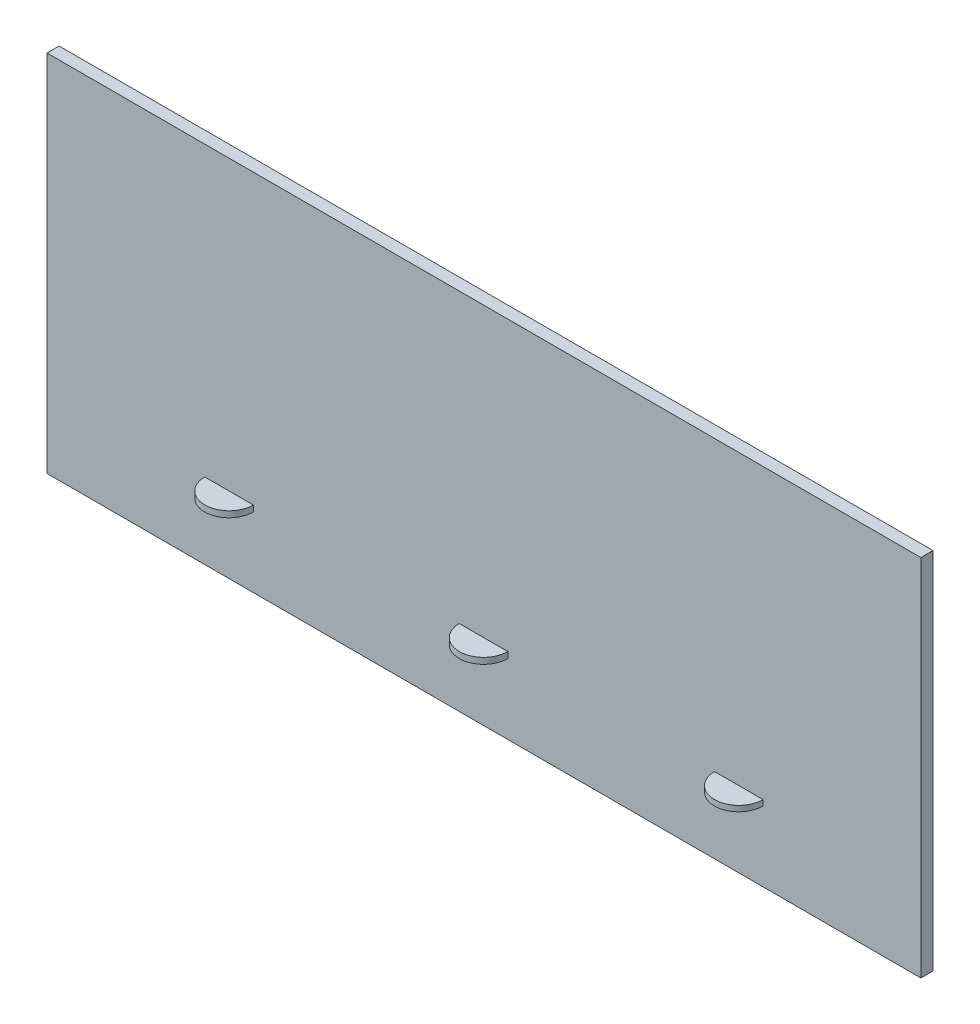
ISO-10303-21;
HEADER;
FILE_DESCRIPTION(('STEP AP214'),'2;1');
FILE_NAME('part.step','',(''),(''),'','','');
FILE_SCHEMA(('AUTOMOTIVE_DESIGN { 1 0 10303 214 1 1 1 1 }'));
ENDSEC;
DATA;
#1=APPLICATION_CONTEXT('core data for automotive mechanical design processes');
#2=APPLICATION_PROTOCOL_DEFINITION('international standard','automotive_design',2000,#1);
#3=PRODUCT_CONTEXT('',#1,'mechanical');
#4=PRODUCT('Part','Part','',(#3));
#5=PRODUCT_RELATED_PRODUCT_CATEGORY('part','',(#4));
#6=PRODUCT_DEFINITION_FORMATION('','',#4);
#7=PRODUCT_DEFINITION_CONTEXT('part definition',#1,'design');
#8=PRODUCT_DEFINITION('design','',#6,#7);
#9=PRODUCT_DEFINITION_SHAPE('','',#8);
#10=(LENGTH_UNIT() NAMED_UNIT(*) SI_UNIT(.MILLI.,.METRE.));
#11=(NAMED_UNIT(*) PLANE_ANGLE_UNIT() SI_UNIT($,.RADIAN.));
#12=(NAMED_UNIT(*) SI_UNIT($,.STERADIAN.) SOLID_ANGLE_UNIT());
#13=UNCERTAINTY_MEASURE_WITH_UNIT(LENGTH_MEASURE(1.E-05),#10,'distance_accuracy_value','');
#14=(GEOMETRIC_REPRESENTATION_CONTEXT(3) GLOBAL_UNCERTAINTY_ASSIGNED_CONTEXT((#13)) GLOBAL_UNIT_ASSIGNED_CONTEXT((#10,
#11,#12)) REPRESENTATION_CONTEXT('',''));
#15=CARTESIAN_POINT('',(0.,0.,0.));
#16=DIRECTION('',(0.,0.,1.));
#17=DIRECTION('',(1.,0.,0.));
#18=AXIS2_PLACEMENT_3D('',#15,#16,#17);
#19=CARTESIAN_POINT('',(0.,0.,25.4));
#20=DIRECTION('',(0.,0.,1.));
#21=DIRECTION('',(1.,0.,0.));
#22=AXIS2_PLACEMENT_3D('',#19,#20,#21);
#23=PLANE('',#22);
#24=DIRECTION('',(0.,1.,0.));
#25=VECTOR('',#24,1.);
#26=CARTESIAN_POINT('',(392.796405658915,103.491890903693,25.4));
#27=LINE('',#26,#25);
#28=CARTESIAN_POINT('',(392.796405658915,103.491890903693,25.4));
#29=VERTEX_POINT('',#28);
#30=CARTESIAN_POINT('',(392.796405658915,116.191890903693,25.4));
#31=VERTEX_POINT('',#30);
#32=EDGE_CURVE('E109',#29,#31,#27,.T.);
#33=ORIENTED_EDGE('',*,*,#32,.F.);
#34=DIRECTION('',(1.,0.,0.));
#35=VECTOR('',#34,1.);
#36=CARTESIAN_POINT('',(291.196405658915,103.491890903693,25.4));
#37=LINE('',#36,#35);
#38=CARTESIAN_POINT('',(291.196405658915,103.491890903693,25.4));
#39=VERTEX_POINT('',#38);
#40=EDGE_CURVE('E121',#39,#29,#37,.T.);
#41=ORIENTED_EDGE('',*,*,#40,.F.);
#42=DIRECTION('',(0.,-1.,0.));
#43=VECTOR('',#42,1.);
#44=CARTESIAN_POINT('',(291.196405658915,116.191890903693,25.4));
#45=LINE('',#44,#43);
#46=CARTESIAN_POINT('',(291.196405658915,116.191890903693,25.4));
#47=VERTEX_POINT('',#46);
#48=EDGE_CURVE('E128',#47,#39,#45,.T.);
#49=ORIENTED_EDGE('',*,*,#48,.F.);
#50=DIRECTION('',(-1.,0.,0.));
#51=VECTOR('',#50,1.);
#52=CARTESIAN_POINT('',(341.996405658915,116.191890903693,25.4));
#53=LINE('',#52,#51);
#54=EDGE_CURVE('E120',#31,#47,#53,.T.);
#55=ORIENTED_EDGE('',*,*,#54,.F.);
#56=EDGE_LOOP('',(#33,#41,#49,#55));
#57=FACE_BOUND('',#56,.T.);
#58=DIRECTION('',(0.,1.,0.));
#59=VECTOR('',#58,1.);
#60=CARTESIAN_POINT('',(925.404865323267,104.163799968321,25.4));
#61=LINE('',#60,#59);
#62=CARTESIAN_POINT('',(925.404865323267,104.163799968321,25.4));
#63=VERTEX_POINT('',#62);
#64=CARTESIAN_POINT('',(925.404865323267,116.863799968321,25.4));
#65=VERTEX_POINT('',#64);
#66=EDGE_CURVE('E292',#63,#65,#61,.T.);
#67=ORIENTED_EDGE('',*,*,#66,.F.);
#68=DIRECTION('',(1.,0.,0.));
#69=VECTOR('',#68,1.);
#70=CARTESIAN_POINT('',(823.804865323267,104.163799968321,25.4));
#71=LINE('',#70,#69);
#72=CARTESIAN_POINT('',(823.804865323267,104.163799968321,25.4));
#73=VERTEX_POINT('',#72);
#74=EDGE_CURVE('E299',#73,#63,#71,.T.);
#75=ORIENTED_EDGE('',*,*,#74,.F.);
#76=DIRECTION('',(0.,-1.,0.));
#77=VECTOR('',#76,1.);
#78=CARTESIAN_POINT('',(823.804865323267,116.863799968321,25.4));
#79=LINE('',#78,#77);
#80=CARTESIAN_POINT('',(823.804865323267,116.863799968321,25.4));
#81=VERTEX_POINT('',#80);
#82=EDGE_CURVE('E304',#81,#73,#79,.T.);
#83=ORIENTED_EDGE('',*,*,#82,.F.);
#84=DIRECTION('',(-1.,0.,0.));
#85=VECTOR('',#84,1.);
#86=CARTESIAN_POINT('',(874.604865323267,116.863799968321,25.4));
#87=LINE('',#86,#85);
#88=EDGE_CURVE('E298',#65,#81,#87,.T.);
#89=ORIENTED_EDGE('',*,*,#88,.F.);
#90=EDGE_LOOP('',(#67,#75,#83,#89));
#91=FACE_BOUND('',#90,.T.);
#92=DIRECTION('',(0.,1.,0.));
#93=VECTOR('',#92,1.);
#94=CARTESIAN_POINT('',(1459.59640565891,104.010823647008,25.4));
#95=LINE('',#94,#93);
#96=CARTESIAN_POINT('',(1459.59640565891,104.010823647008,25.4));
#97=VERTEX_POINT('',#96);
#98=CARTESIAN_POINT('',(1459.59640565891,115.672958160379,25.4));
#99=VERTEX_POINT('',#98);
#100=EDGE_CURVE('E318',#97,#99,#95,.T.);
#101=ORIENTED_EDGE('',*,*,#100,.F.);
#102=DIRECTION('',(1.,0.,0.));
#103=VECTOR('',#102,1.);
#104=CARTESIAN_POINT('',(1357.99640565891,104.010823647008,25.4));
#105=LINE('',#104,#103);
#106=CARTESIAN_POINT('',(1357.99640565891,104.010823647008,25.4));
#107=VERTEX_POINT('',#106);
#108=EDGE_CURVE('E315',#107,#97,#105,.T.);
#109=ORIENTED_EDGE('',*,*,#108,.F.);
#110=DIRECTION('',(0.,-1.,0.));
#111=VECTOR('',#110,1.);
#112=CARTESIAN_POINT('',(1357.99640565891,115.672958160379,25.4));
#113=LINE('',#112,#111);
#114=CARTESIAN_POINT('',(1357.99640565891,115.672958160379,25.4));
#115=VERTEX_POINT('',#114);
#116=EDGE_CURVE('E322',#115,#107,#113,.T.);
#117=ORIENTED_EDGE('',*,*,#116,.F.);
#118=DIRECTION('',(-1.,0.,0.));
#119=VECTOR('',#118,1.);
#120=CARTESIAN_POINT('',(1408.79640565891,115.672958160379,25.4));
#121=LINE('',#120,#119);
#122=EDGE_CURVE('E320',#99,#115,#121,.T.);
#123=ORIENTED_EDGE('',*,*,#122,.F.);
#124=EDGE_LOOP('',(#101,#109,#117,#123));
#125=FACE_BOUND('',#124,.T.);
#126=DIRECTION('',(1.,0.,0.));
#127=VECTOR('',#126,1.);
#128=CARTESIAN_POINT('',(-39.0035943410847,-42.5581090963068,25.4));
#129=LINE('',#128,#127);
#130=CARTESIAN_POINT('',(-39.0035943410847,-42.5581090963068,25.4));
#131=VERTEX_POINT('',#130);
#132=CARTESIAN_POINT('',(1789.79640565891,-42.5581090963068,25.4));
#133=VERTEX_POINT('',#132);
#134=EDGE_CURVE('E137',#131,#133,#129,.T.);
#135=ORIENTED_EDGE('',*,*,#134,.T.);
#136=DIRECTION('',(0.,1.,0.));
#137=VECTOR('',#136,1.);
#138=CARTESIAN_POINT('',(1789.79640565892,719.441890903693,25.4));
#139=LINE('',#138,#137);
#140=CARTESIAN_POINT('',(1789.79640565892,719.441890903693,25.4));
#141=VERTEX_POINT('',#140);
#142=EDGE_CURVE('E140',#133,#141,#139,.T.);
#143=ORIENTED_EDGE('',*,*,#142,.T.);
#144=DIRECTION('',(-1.,0.,0.));
#145=VECTOR('',#144,1.);
#146=CARTESIAN_POINT('',(-39.0035943410848,719.441890903693,25.4));
#147=LINE('',#146,#145);
#148=CARTESIAN_POINT('',(-39.0035943410848,719.441890903693,25.4));
#149=VERTEX_POINT('',#148);
#150=EDGE_CURVE('E142',#141,#149,#147,.T.);
#151=ORIENTED_EDGE('',*,*,#150,.T.);
#152=DIRECTION('',(0.,-1.,0.));
#153=VECTOR('',#152,1.);
#154=CARTESIAN_POINT('',(-39.0035943410848,719.441890903693,25.4));
#155=LINE('',#154,#153);
#156=EDGE_CURVE('E134',#149,#131,#155,.T.);
#157=ORIENTED_EDGE('',*,*,#156,.T.);
#158=EDGE_LOOP('',(#135,#143,#151,#157));
#159=FACE_BOUND('',#158,.T.);
#160=ADVANCED_FACE('F33',(#57,#91,#125,#159),#23,.T.);
#161=CARTESIAN_POINT('',(-39.0035943410848,719.441890903693,25.4));
#162=DIRECTION('',(1.,0.,0.));
#163=DIRECTION('',(0.,1.,0.));
#164=AXIS2_PLACEMENT_3D('',#161,#162,#163);
#165=PLANE('',#164);
#166=DIRECTION('',(0.,-1.,0.));
#167=VECTOR('',#166,1.);
#168=CARTESIAN_POINT('',(-39.0035943410848,719.441890903693,0.));
#169=LINE('',#168,#167);
#170=CARTESIAN_POINT('',(-39.0035943410848,719.441890903693,0.));
#171=VERTEX_POINT('',#170);
#172=CARTESIAN_POINT('',(-39.0035943410847,-42.5581090963068,0.));
#173=VERTEX_POINT('',#172);
#174=EDGE_CURVE('E130',#171,#173,#169,.T.);
#175=ORIENTED_EDGE('',*,*,#174,.T.);
#176=DIRECTION('',(0.,0.,-1.));
#177=VECTOR('',#176,1.);
#178=CARTESIAN_POINT('',(-39.0035943410847,-42.5581090963068,25.4));
#179=LINE('',#178,#177);
#180=EDGE_CURVE('E11',#131,#173,#179,.T.);
#181=ORIENTED_EDGE('',*,*,#180,.F.);
#182=ORIENTED_EDGE('',*,*,#156,.F.);
#183=DIRECTION('',(0.,0.,-1.));
#184=VECTOR('',#183,1.);
#185=CARTESIAN_POINT('',(-39.0035943410848,719.441890903693,25.4));
#186=LINE('',#185,#184);
#187=EDGE_CURVE('E144',#149,#171,#186,.T.);
#188=ORIENTED_EDGE('',*,*,#187,.T.);
#189=EDGE_LOOP('',(#175,#181,#182,#188));
#190=FACE_BOUND('',#189,.T.);
#191=ADVANCED_FACE('F35',(#190),#165,.F.);
#192=CARTESIAN_POINT('',(-39.0035943410847,-42.5581090963068,25.4));
#193=DIRECTION('',(0.,1.,0.));
#194=DIRECTION('',(0.,0.,1.));
#195=AXIS2_PLACEMENT_3D('',#192,#193,#194);
#196=PLANE('',#195);
#197=DIRECTION('',(1.,0.,0.));
#198=VECTOR('',#197,1.);
#199=CARTESIAN_POINT('',(-39.0035943410847,-42.5581090963068,0.));
#200=LINE('',#199,#198);
#201=CARTESIAN_POINT('',(1789.79640565891,-42.5581090963068,0.));
#202=VERTEX_POINT('',#201);
#203=EDGE_CURVE('E147',#173,#202,#200,.T.);
#204=ORIENTED_EDGE('',*,*,#203,.T.);
#205=DIRECTION('',(0.,0.,-1.));
#206=VECTOR('',#205,1.);
#207=CARTESIAN_POINT('',(1789.79640565891,-42.5581090963068,25.4));
#208=LINE('',#207,#206);
#209=EDGE_CURVE('E41',#133,#202,#208,.T.);
#210=ORIENTED_EDGE('',*,*,#209,.F.);
#211=ORIENTED_EDGE('',*,*,#134,.F.);
#212=ORIENTED_EDGE('',*,*,#180,.T.);
#213=EDGE_LOOP('',(#204,#210,#211,#212));
#214=FACE_BOUND('',#213,.T.);
#215=ADVANCED_FACE('F176',(#214),#196,.F.);
#216=CARTESIAN_POINT('',(1789.79640565892,719.441890903693,25.4));
#217=DIRECTION('',(-1.,0.,0.));
#218=DIRECTION('',(0.,-1.,0.));
#219=AXIS2_PLACEMENT_3D('',#216,#217,#218);
#220=PLANE('',#219);
#221=DIRECTION('',(0.,1.,0.));
#222=VECTOR('',#221,1.);
#223=CARTESIAN_POINT('',(1789.79640565892,719.441890903693,0.));
#224=LINE('',#223,#222);
#225=CARTESIAN_POINT('',(1789.79640565892,719.441890903693,0.));
#226=VERTEX_POINT('',#225);
#227=EDGE_CURVE('E149',#202,#226,#224,.T.);
#228=ORIENTED_EDGE('',*,*,#227,.T.);
#229=DIRECTION('',(0.,0.,-1.));
#230=VECTOR('',#229,1.);
#231=CARTESIAN_POINT('',(1789.79640565892,719.441890903693,25.4));
#232=LINE('',#231,#230);
#233=EDGE_CURVE('E154',#141,#226,#232,.T.);
#234=ORIENTED_EDGE('',*,*,#233,.F.);
#235=ORIENTED_EDGE('',*,*,#142,.F.);
#236=ORIENTED_EDGE('',*,*,#209,.T.);
#237=EDGE_LOOP('',(#228,#234,#235,#236));
#238=FACE_BOUND('',#237,.T.);
#239=ADVANCED_FACE('F161',(#238),#220,.F.);
#240=CARTESIAN_POINT('',(-39.0035943410848,719.441890903693,25.4));
#241=DIRECTION('',(0.,-1.,0.));
#242=DIRECTION('',(0.,0.,-1.));
#243=AXIS2_PLACEMENT_3D('',#240,#241,#242);
#244=PLANE('',#243);
#245=DIRECTION('',(-1.,0.,0.));
#246=VECTOR('',#245,1.);
#247=CARTESIAN_POINT('',(-39.0035943410848,719.441890903693,0.));
#248=LINE('',#247,#246);
#249=EDGE_CURVE('E138',#226,#171,#248,.T.);
#250=ORIENTED_EDGE('',*,*,#249,.T.);
#251=ORIENTED_EDGE('',*,*,#187,.F.);
#252=ORIENTED_EDGE('',*,*,#150,.F.);
#253=ORIENTED_EDGE('',*,*,#233,.T.);
#254=EDGE_LOOP('',(#250,#251,#252,#253));
#255=FACE_BOUND('',#254,.T.);
#256=ADVANCED_FACE('F170',(#255),#244,.F.);
#257=CARTESIAN_POINT('',(0.,0.,0.));
#258=DIRECTION('',(0.,0.,1.));
#259=DIRECTION('',(1.,0.,0.));
#260=AXIS2_PLACEMENT_3D('',#257,#258,#259);
#261=PLANE('',#260);
#262=ORIENTED_EDGE('',*,*,#174,.F.);
#263=ORIENTED_EDGE('',*,*,#249,.F.);
#264=ORIENTED_EDGE('',*,*,#227,.F.);
#265=ORIENTED_EDGE('',*,*,#203,.F.);
#266=EDGE_LOOP('',(#262,#263,#264,#265));
#267=FACE_BOUND('',#266,.T.);
#268=ADVANCED_FACE('F167',(#267),#261,.F.);
#269=CARTESIAN_POINT('',(291.196405658915,103.491890903693,101.6));
#270=DIRECTION('',(0.,1.,0.));
#271=DIRECTION('',(0.,0.,1.));
#272=AXIS2_PLACEMENT_3D('',#269,#270,#271);
#273=PLANE('',#272);
#274=ORIENTED_EDGE('',*,*,#40,.T.);
#275=CARTESIAN_POINT('',(341.996405658915,103.491890903693,25.3999999999999));
#276=DIRECTION('',(0.,1.,0.));
#277=DIRECTION('',(0.,0.,1.));
#278=AXIS2_PLACEMENT_3D('',#275,#276,#277);
#279=CIRCLE('',#278,50.8);
#280=EDGE_CURVE('E115',#29,#39,#279,.F.);
#281=ORIENTED_EDGE('',*,*,#280,.T.);
#282=EDGE_LOOP('',(#274,#281));
#283=FACE_BOUND('',#282,.T.);
#284=ADVANCED_FACE('F191',(#283),#273,.F.);
#285=CARTESIAN_POINT('',(341.996405658915,116.191890903693,101.6));
#286=DIRECTION('',(0.,-1.,0.));
#287=DIRECTION('',(1.,0.,0.));
#288=AXIS2_PLACEMENT_3D('',#285,#286,#287);
#289=PLANE('',#288);
#290=ORIENTED_EDGE('',*,*,#54,.T.);
#291=CARTESIAN_POINT('',(341.996405658915,116.191890903693,25.3999999999999));
#292=DIRECTION('',(0.,-1.,0.));
#293=DIRECTION('',(1.,0.,0.));
#294=AXIS2_PLACEMENT_3D('',#291,#292,#293);
#295=CIRCLE('',#294,50.8);
#296=EDGE_CURVE('E112',#31,#47,#295,.T.);
#297=ORIENTED_EDGE('',*,*,#296,.F.);
#298=EDGE_LOOP('',(#290,#297));
#299=FACE_BOUND('',#298,.T.);
#300=ADVANCED_FACE('F124',(#299),#289,.F.);
#301=CARTESIAN_POINT('',(823.804865323267,104.163799968321,101.6));
#302=DIRECTION('',(0.,1.,0.));
#303=DIRECTION('',(0.,0.,1.));
#304=AXIS2_PLACEMENT_3D('',#301,#302,#303);
#305=PLANE('',#304);
#306=ORIENTED_EDGE('',*,*,#74,.T.);
#307=CARTESIAN_POINT('',(874.604865323267,104.163799968321,25.3999999999999));
#308=DIRECTION('',(0.,1.,0.));
#309=DIRECTION('',(0.,0.,1.));
#310=AXIS2_PLACEMENT_3D('',#307,#308,#309);
#311=CIRCLE('',#310,50.8000000000001);
#312=EDGE_CURVE('E294',#63,#73,#311,.F.);
#313=ORIENTED_EDGE('',*,*,#312,.T.);
#314=EDGE_LOOP('',(#306,#313));
#315=FACE_BOUND('',#314,.T.);
#316=ADVANCED_FACE('F220',(#315),#305,.F.);
#317=CARTESIAN_POINT('',(874.604865323267,116.863799968321,101.6));
#318=DIRECTION('',(0.,-1.,0.));
#319=DIRECTION('',(0.,0.,-1.));
#320=AXIS2_PLACEMENT_3D('',#317,#318,#319);
#321=PLANE('',#320);
#322=ORIENTED_EDGE('',*,*,#88,.T.);
#323=CARTESIAN_POINT('',(874.604865323267,116.863799968321,25.3999999999999));
#324=DIRECTION('',(0.,-1.,0.));
#325=DIRECTION('',(0.,0.,-1.));
#326=AXIS2_PLACEMENT_3D('',#323,#324,#325);
#327=CIRCLE('',#326,50.8000000000001);
#328=EDGE_CURVE('E56',#65,#81,#327,.T.);
#329=ORIENTED_EDGE('',*,*,#328,.F.);
#330=EDGE_LOOP('',(#322,#329));
#331=FACE_BOUND('',#330,.T.);
#332=ADVANCED_FACE('F229',(#331),#321,.F.);
#333=CARTESIAN_POINT('',(1357.99640565891,104.010823647008,101.6));
#334=DIRECTION('',(0.,1.,0.));
#335=DIRECTION('',(-1.,0.,0.));
#336=AXIS2_PLACEMENT_3D('',#333,#334,#335);
#337=PLANE('',#336);
#338=ORIENTED_EDGE('',*,*,#108,.T.);
#339=CARTESIAN_POINT('',(1408.79640565891,104.010823647008,25.4));
#340=DIRECTION('',(0.,1.,0.));
#341=DIRECTION('',(-1.,0.,0.));
#342=AXIS2_PLACEMENT_3D('',#339,#340,#341);
#343=CIRCLE('',#342,50.8);
#344=EDGE_CURVE('E312',#97,#107,#343,.F.);
#345=ORIENTED_EDGE('',*,*,#344,.T.);
#346=EDGE_LOOP('',(#338,#345));
#347=FACE_BOUND('',#346,.T.);
#348=ADVANCED_FACE('F241',(#347),#337,.F.);
#349=CARTESIAN_POINT('',(1408.79640565891,115.672958160379,101.6));
#350=DIRECTION('',(0.,-1.,0.));
#351=DIRECTION('',(1.,0.,0.));
#352=AXIS2_PLACEMENT_3D('',#349,#350,#351);
#353=PLANE('',#352);
#354=ORIENTED_EDGE('',*,*,#122,.T.);
#355=CARTESIAN_POINT('',(1408.79640565891,115.672958160379,25.4));
#356=DIRECTION('',(0.,-1.,0.));
#357=DIRECTION('',(1.,0.,0.));
#358=AXIS2_PLACEMENT_3D('',#355,#356,#357);
#359=CIRCLE('',#358,50.8);
#360=EDGE_CURVE('E48',#99,#115,#359,.T.);
#361=ORIENTED_EDGE('',*,*,#360,.F.);
#362=EDGE_LOOP('',(#354,#361));
#363=FACE_BOUND('',#362,.T.);
#364=ADVANCED_FACE('F251',(#363),#353,.F.);
#365=CARTESIAN_POINT('',(1408.79640565891,-42.5581090963069,25.4));
#366=DIRECTION('',(0.,1.,0.));
#367=DIRECTION('',(-1.,0.,0.));
#368=AXIS2_PLACEMENT_3D('',#365,#366,#367);
#369=CYLINDRICAL_SURFACE('',#368,50.8);
#370=ORIENTED_EDGE('',*,*,#100,.T.);
#371=ORIENTED_EDGE('',*,*,#360,.T.);
#372=ORIENTED_EDGE('',*,*,#116,.T.);
#373=ORIENTED_EDGE('',*,*,#344,.F.);
#374=EDGE_LOOP('',(#370,#371,#372,#373));
#375=FACE_BOUND('',#374,.T.);
#376=ADVANCED_FACE('F258',(#375),#369,.T.);
#377=CARTESIAN_POINT('',(874.604865323267,0.0237999683208451,25.3999999999999));
#378=DIRECTION('',(0.,1.,0.));
#379=DIRECTION('',(0.,0.,1.));
#380=AXIS2_PLACEMENT_3D('',#377,#378,#379);
#381=CYLINDRICAL_SURFACE('',#380,50.8000000000001);
#382=ORIENTED_EDGE('',*,*,#66,.T.);
#383=ORIENTED_EDGE('',*,*,#328,.T.);
#384=ORIENTED_EDGE('',*,*,#82,.T.);
#385=ORIENTED_EDGE('',*,*,#312,.F.);
#386=EDGE_LOOP('',(#382,#383,#384,#385));
#387=FACE_BOUND('',#386,.T.);
#388=ADVANCED_FACE('F265',(#387),#381,.T.);
#389=CARTESIAN_POINT('',(341.996405658915,-0.648109096306776,25.3999999999999));
#390=DIRECTION('',(0.,1.,0.));
#391=DIRECTION('',(-1.,0.,0.));
#392=AXIS2_PLACEMENT_3D('',#389,#390,#391);
#393=CYLINDRICAL_SURFACE('',#392,50.8);
#394=ORIENTED_EDGE('',*,*,#32,.T.);
#395=ORIENTED_EDGE('',*,*,#296,.T.);
#396=ORIENTED_EDGE('',*,*,#48,.T.);
#397=ORIENTED_EDGE('',*,*,#280,.F.);
#398=EDGE_LOOP('',(#394,#395,#396,#397));
#399=FACE_BOUND('',#398,.T.);
#400=ADVANCED_FACE('F111',(#399),#393,.T.);
#401=CLOSED_SHELL('',(#160,#191,#215,#239,#256,#268,#284,#300,#316,#332,#348,#364,#376,#388,#400));
#402=MANIFOLD_SOLID_BREP('B2',#401);
#403=ADVANCED_BREP_SHAPE_REPRESENTATION('',(#18,#402),#14);
#404=SHAPE_DEFINITION_REPRESENTATION(#9,#403);
ENDSEC;
END-ISO-10303-21;
